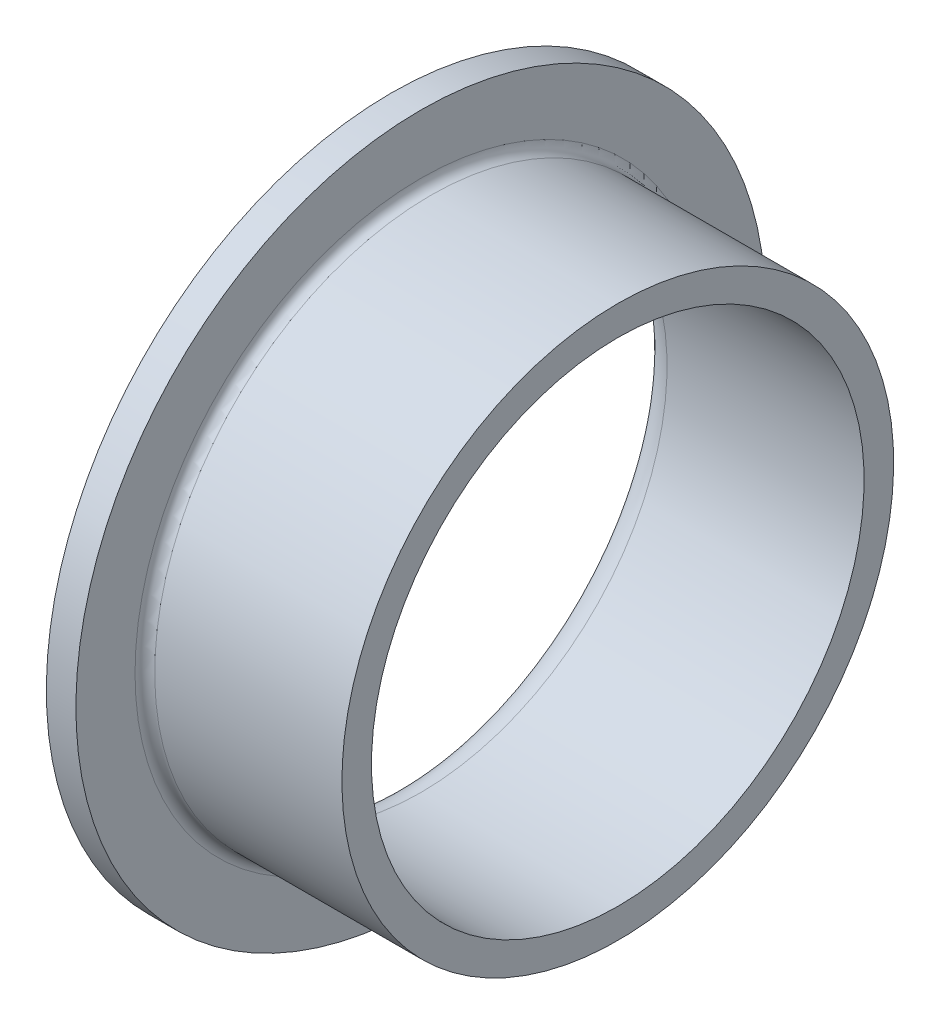
ISO-10303-21;
HEADER;
FILE_DESCRIPTION(('STEP AP214'),'2;1');
FILE_NAME('part.step','',(''),(''),'','','');
FILE_SCHEMA(('AUTOMOTIVE_DESIGN { 1 0 10303 214 1 1 1 1 }'));
ENDSEC;
DATA;
#1=APPLICATION_CONTEXT('core data for automotive mechanical design processes');
#2=APPLICATION_PROTOCOL_DEFINITION('international standard','automotive_design',2000,#1);
#3=PRODUCT_CONTEXT('',#1,'mechanical');
#4=PRODUCT('Part','Part','',(#3));
#5=PRODUCT_RELATED_PRODUCT_CATEGORY('part','',(#4));
#6=PRODUCT_DEFINITION_FORMATION('','',#4);
#7=PRODUCT_DEFINITION_CONTEXT('part definition',#1,'design');
#8=PRODUCT_DEFINITION('design','',#6,#7);
#9=PRODUCT_DEFINITION_SHAPE('','',#8);
#10=(LENGTH_UNIT() NAMED_UNIT(*) SI_UNIT(.MILLI.,.METRE.));
#11=(NAMED_UNIT(*) PLANE_ANGLE_UNIT() SI_UNIT($,.RADIAN.));
#12=(NAMED_UNIT(*) SI_UNIT($,.STERADIAN.) SOLID_ANGLE_UNIT());
#13=UNCERTAINTY_MEASURE_WITH_UNIT(LENGTH_MEASURE(1.E-05),#10,'distance_accuracy_value','');
#14=(GEOMETRIC_REPRESENTATION_CONTEXT(3) GLOBAL_UNCERTAINTY_ASSIGNED_CONTEXT((#13)) GLOBAL_UNIT_ASSIGNED_CONTEXT((#10,
#11,#12)) REPRESENTATION_CONTEXT('',''));
#15=CARTESIAN_POINT('',(0.,0.,0.));
#16=DIRECTION('',(0.,0.,1.));
#17=DIRECTION('',(1.,0.,0.));
#18=AXIS2_PLACEMENT_3D('',#15,#16,#17);
#19=CARTESIAN_POINT('',(-11.5,15.75,0.));
#20=DIRECTION('',(-1.,0.,0.));
#21=DIRECTION('',(0.,0.,1.));
#22=AXIS2_PLACEMENT_3D('',#19,#20,#21);
#23=PLANE('',#22);
#24=CARTESIAN_POINT('',(-11.5,0.,0.));
#25=DIRECTION('',(-1.,0.,0.));
#26=DIRECTION('',(0.,1.,0.));
#27=AXIS2_PLACEMENT_3D('',#24,#25,#26);
#28=CIRCLE('',#27,14.);
#29=CARTESIAN_POINT('',(-11.5,14.,0.));
#30=VERTEX_POINT('',#29);
#31=EDGE_CURVE('E118',#30,#30,#28,.T.);
#32=ORIENTED_EDGE('',*,*,#31,.F.);
#33=EDGE_LOOP('',(#32));
#34=FACE_BOUND('',#33,.T.);
#35=CARTESIAN_POINT('',(-11.5,0.,0.));
#36=DIRECTION('',(1.,0.,0.));
#37=DIRECTION('',(0.,1.,0.));
#38=AXIS2_PLACEMENT_3D('',#35,#36,#37);
#39=CIRCLE('',#38,17.5);
#40=CARTESIAN_POINT('',(-11.5,17.5,0.));
#41=VERTEX_POINT('',#40);
#42=EDGE_CURVE('E19',#41,#41,#39,.T.);
#43=ORIENTED_EDGE('',*,*,#42,.F.);
#44=EDGE_LOOP('',(#43));
#45=FACE_BOUND('',#44,.T.);
#46=ADVANCED_FACE('F15',(#34,#45),#23,.T.);
#47=CARTESIAN_POINT('',(-10.,0.,0.));
#48=DIRECTION('',(1.,0.,0.));
#49=DIRECTION('',(0.,0.,-1.));
#50=AXIS2_PLACEMENT_3D('',#47,#48,#49);
#51=TOROIDAL_SURFACE('',#50,14.,1.5);
#52=CARTESIAN_POINT('',(-10.,0.,0.));
#53=DIRECTION('',(1.,0.,0.));
#54=DIRECTION('',(0.,1.,0.));
#55=AXIS2_PLACEMENT_3D('',#52,#53,#54);
#56=CIRCLE('',#55,12.5);
#57=CARTESIAN_POINT('',(-10.,12.5,0.));
#58=VERTEX_POINT('',#57);
#59=EDGE_CURVE('E53',#58,#58,#56,.T.);
#60=ORIENTED_EDGE('',*,*,#59,.T.);
#61=EDGE_LOOP('',(#60));
#62=FACE_BOUND('',#61,.T.);
#63=ORIENTED_EDGE('',*,*,#31,.T.);
#64=EDGE_LOOP('',(#63));
#65=FACE_BOUND('',#64,.T.);
#66=ADVANCED_FACE('F68',(#62,#65),#51,.T.);
#67=CARTESIAN_POINT('',(-10.75,0.,0.));
#68=DIRECTION('',(1.,0.,0.));
#69=DIRECTION('',(0.,1.,0.));
#70=AXIS2_PLACEMENT_3D('',#67,#68,#69);
#71=CYLINDRICAL_SURFACE('',#70,17.5);
#72=ORIENTED_EDGE('',*,*,#42,.T.);
#73=EDGE_LOOP('',(#72));
#74=FACE_BOUND('',#73,.T.);
#75=CARTESIAN_POINT('',(-10.,0.,0.));
#76=DIRECTION('',(1.,0.,0.));
#77=DIRECTION('',(0.,1.,0.));
#78=AXIS2_PLACEMENT_3D('',#75,#76,#77);
#79=CIRCLE('',#78,17.5);
#80=CARTESIAN_POINT('',(-10.,17.5,0.));
#81=VERTEX_POINT('',#80);
#82=EDGE_CURVE('E61',#81,#81,#79,.T.);
#83=ORIENTED_EDGE('',*,*,#82,.F.);
#84=EDGE_LOOP('',(#83));
#85=FACE_BOUND('',#84,.T.);
#86=ADVANCED_FACE('F72',(#74,#85),#71,.T.);
#87=CARTESIAN_POINT('',(-5.,0.,0.));
#88=DIRECTION('',(1.,0.,0.));
#89=DIRECTION('',(0.,1.,0.));
#90=AXIS2_PLACEMENT_3D('',#87,#88,#89);
#91=CYLINDRICAL_SURFACE('',#90,12.5);
#92=CARTESIAN_POINT('',(0.,0.,0.));
#93=DIRECTION('',(1.,0.,0.));
#94=DIRECTION('',(0.,1.,0.));
#95=AXIS2_PLACEMENT_3D('',#92,#93,#94);
#96=CIRCLE('',#95,12.5);
#97=CARTESIAN_POINT('',(0.,12.5,0.));
#98=VERTEX_POINT('',#97);
#99=EDGE_CURVE('E86',#98,#98,#96,.F.);
#100=ORIENTED_EDGE('',*,*,#99,.F.);
#101=EDGE_LOOP('',(#100));
#102=FACE_BOUND('',#101,.T.);
#103=ORIENTED_EDGE('',*,*,#59,.F.);
#104=EDGE_LOOP('',(#103));
#105=FACE_BOUND('',#104,.T.);
#106=ADVANCED_FACE('F94',(#102,#105),#91,.F.);
#107=CARTESIAN_POINT('',(-10.,16.,0.));
#108=DIRECTION('',(1.,0.,0.));
#109=DIRECTION('',(0.,0.,-1.));
#110=AXIS2_PLACEMENT_3D('',#107,#108,#109);
#111=PLANE('',#110);
#112=CARTESIAN_POINT('',(-10.,0.,0.));
#113=DIRECTION('',(1.,0.,0.));
#114=DIRECTION('',(0.,1.,0.));
#115=AXIS2_PLACEMENT_3D('',#112,#113,#114);
#116=CIRCLE('',#115,14.5);
#117=CARTESIAN_POINT('',(-10.,14.5,0.));
#118=VERTEX_POINT('',#117);
#119=EDGE_CURVE('E28',#118,#118,#116,.F.);
#120=ORIENTED_EDGE('',*,*,#119,.T.);
#121=EDGE_LOOP('',(#120));
#122=FACE_BOUND('',#121,.T.);
#123=ORIENTED_EDGE('',*,*,#82,.T.);
#124=EDGE_LOOP('',(#123));
#125=FACE_BOUND('',#124,.T.);
#126=ADVANCED_FACE('F91',(#122,#125),#111,.T.);
#127=CARTESIAN_POINT('',(0.,13.25,0.));
#128=DIRECTION('',(1.,0.,0.));
#129=DIRECTION('',(0.,0.,-1.));
#130=AXIS2_PLACEMENT_3D('',#127,#128,#129);
#131=PLANE('',#130);
#132=ORIENTED_EDGE('',*,*,#99,.T.);
#133=EDGE_LOOP('',(#132));
#134=FACE_BOUND('',#133,.T.);
#135=CARTESIAN_POINT('',(0.,0.,0.));
#136=DIRECTION('',(1.,0.,0.));
#137=DIRECTION('',(0.,1.,0.));
#138=AXIS2_PLACEMENT_3D('',#135,#136,#137);
#139=CIRCLE('',#138,14.);
#140=CARTESIAN_POINT('',(0.,14.,0.));
#141=VERTEX_POINT('',#140);
#142=EDGE_CURVE('E23',#141,#141,#139,.F.);
#143=ORIENTED_EDGE('',*,*,#142,.F.);
#144=EDGE_LOOP('',(#143));
#145=FACE_BOUND('',#144,.T.);
#146=ADVANCED_FACE('F44',(#134,#145),#131,.T.);
#147=CARTESIAN_POINT('',(-9.5,0.,0.));
#148=DIRECTION('',(1.,0.,0.));
#149=DIRECTION('',(0.,0.,-1.));
#150=AXIS2_PLACEMENT_3D('',#147,#148,#149);
#151=TOROIDAL_SURFACE('',#150,14.5,0.499999999999999);
#152=ORIENTED_EDGE('',*,*,#119,.F.);
#153=EDGE_LOOP('',(#152));
#154=FACE_BOUND('',#153,.T.);
#155=CARTESIAN_POINT('',(-9.5,0.,0.));
#156=DIRECTION('',(1.,0.,0.));
#157=DIRECTION('',(0.,1.,0.));
#158=AXIS2_PLACEMENT_3D('',#155,#156,#157);
#159=CIRCLE('',#158,14.);
#160=CARTESIAN_POINT('',(-9.5,14.,0.));
#161=VERTEX_POINT('',#160);
#162=EDGE_CURVE('E10',#161,#161,#159,.T.);
#163=ORIENTED_EDGE('',*,*,#162,.F.);
#164=EDGE_LOOP('',(#163));
#165=FACE_BOUND('',#164,.T.);
#166=ADVANCED_FACE('F38',(#154,#165),#151,.F.);
#167=CARTESIAN_POINT('',(-4.75,0.,0.));
#168=DIRECTION('',(1.,0.,0.));
#169=DIRECTION('',(0.,1.,0.));
#170=AXIS2_PLACEMENT_3D('',#167,#168,#169);
#171=CYLINDRICAL_SURFACE('',#170,14.);
#172=ORIENTED_EDGE('',*,*,#162,.T.);
#173=EDGE_LOOP('',(#172));
#174=FACE_BOUND('',#173,.T.);
#175=ORIENTED_EDGE('',*,*,#142,.T.);
#176=EDGE_LOOP('',(#175));
#177=FACE_BOUND('',#176,.T.);
#178=ADVANCED_FACE('F43',(#174,#177),#171,.T.);
#179=CLOSED_SHELL('',(#46,#66,#86,#106,#126,#146,#166,#178));
#180=MANIFOLD_SOLID_BREP('B1',#179);
#181=ADVANCED_BREP_SHAPE_REPRESENTATION('',(#18,#180),#14);
#182=SHAPE_DEFINITION_REPRESENTATION(#9,#181);
ENDSEC;
END-ISO-10303-21;
